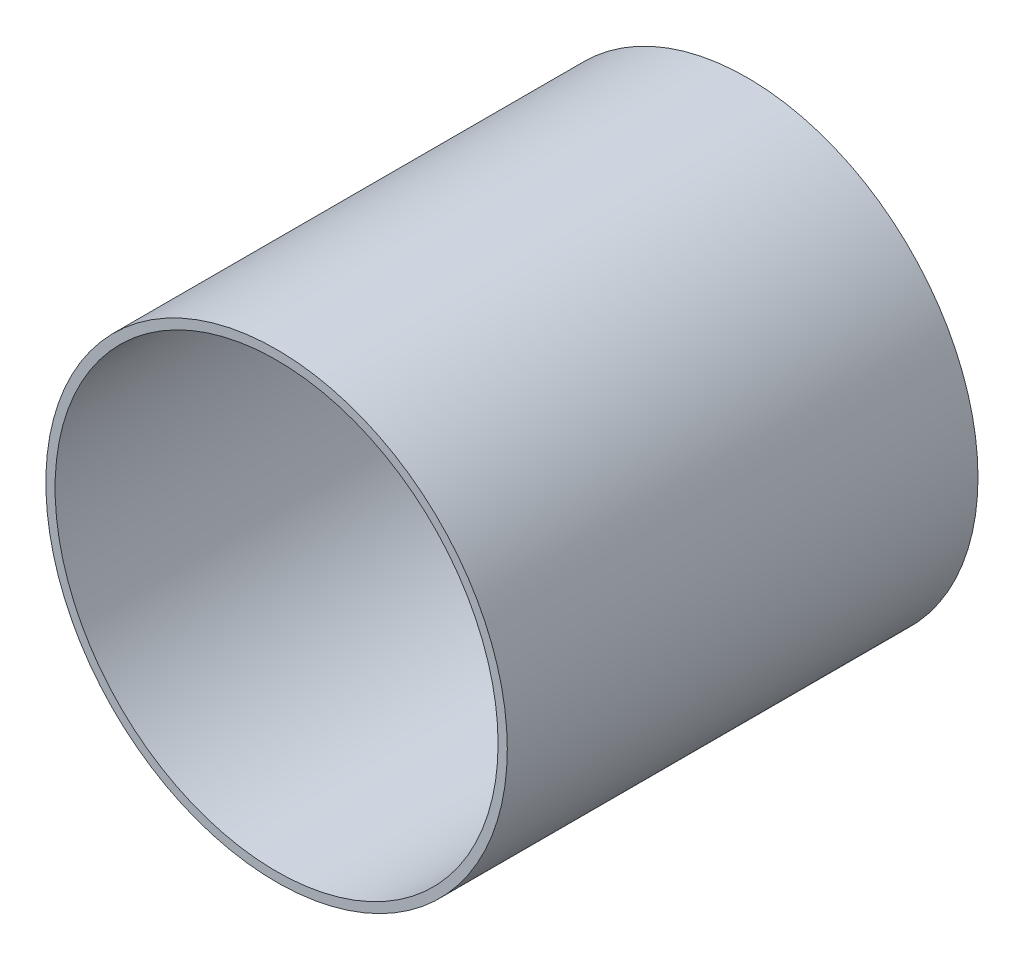
ISO-10303-21;
HEADER;
FILE_DESCRIPTION(('STEP AP214'),'2;1');
FILE_NAME('part.step','',(''),(''),'','','');
FILE_SCHEMA(('AUTOMOTIVE_DESIGN { 1 0 10303 214 1 1 1 1 }'));
ENDSEC;
DATA;
#1=APPLICATION_CONTEXT('core data for automotive mechanical design processes');
#2=APPLICATION_PROTOCOL_DEFINITION('international standard','automotive_design',2000,#1);
#3=PRODUCT_CONTEXT('',#1,'mechanical');
#4=PRODUCT('Part','Part','',(#3));
#5=PRODUCT_RELATED_PRODUCT_CATEGORY('part','',(#4));
#6=PRODUCT_DEFINITION_FORMATION('','',#4);
#7=PRODUCT_DEFINITION_CONTEXT('part definition',#1,'design');
#8=PRODUCT_DEFINITION('design','',#6,#7);
#9=PRODUCT_DEFINITION_SHAPE('','',#8);
#10=(LENGTH_UNIT() NAMED_UNIT(*) SI_UNIT(.MILLI.,.METRE.));
#11=(NAMED_UNIT(*) PLANE_ANGLE_UNIT() SI_UNIT($,.RADIAN.));
#12=(NAMED_UNIT(*) SI_UNIT($,.STERADIAN.) SOLID_ANGLE_UNIT());
#13=UNCERTAINTY_MEASURE_WITH_UNIT(LENGTH_MEASURE(1.E-05),#10,'distance_accuracy_value','');
#14=(GEOMETRIC_REPRESENTATION_CONTEXT(3) GLOBAL_UNCERTAINTY_ASSIGNED_CONTEXT((#13)) GLOBAL_UNIT_ASSIGNED_CONTEXT((#10,
#11,#12)) REPRESENTATION_CONTEXT('',''));
#15=CARTESIAN_POINT('',(0.,0.,0.));
#16=DIRECTION('',(0.,0.,1.));
#17=DIRECTION('',(1.,0.,0.));
#18=AXIS2_PLACEMENT_3D('',#15,#16,#17);
#19=CARTESIAN_POINT('',(0.,0.,3.));
#20=DIRECTION('',(0.,0.,-1.));
#21=DIRECTION('',(-1.,0.,0.));
#22=AXIS2_PLACEMENT_3D('',#19,#20,#21);
#23=CYLINDRICAL_SURFACE('',#22,75.);
#24=CARTESIAN_POINT('',(0.,0.,0.));
#25=DIRECTION('',(0.,0.,1.));
#26=DIRECTION('',(1.,0.,0.));
#27=AXIS2_PLACEMENT_3D('',#24,#25,#26);
#28=CIRCLE('',#27,75.);
#29=CARTESIAN_POINT('',(75.,0.,0.));
#30=VERTEX_POINT('',#29);
#31=EDGE_CURVE('E44',#30,#30,#28,.T.);
#32=ORIENTED_EDGE('',*,*,#31,.T.);
#33=EDGE_LOOP('',(#32));
#34=FACE_BOUND('',#33,.T.);
#35=CARTESIAN_POINT('',(0.,0.,153.));
#36=DIRECTION('',(0.,0.,1.));
#37=DIRECTION('',(1.,0.,0.));
#38=AXIS2_PLACEMENT_3D('',#35,#36,#37);
#39=CIRCLE('',#38,75.);
#40=CARTESIAN_POINT('',(75.,0.,153.));
#41=VERTEX_POINT('',#40);
#42=EDGE_CURVE('E49',#41,#41,#39,.T.);
#43=ORIENTED_EDGE('',*,*,#42,.F.);
#44=EDGE_LOOP('',(#43));
#45=FACE_BOUND('',#44,.T.);
#46=ADVANCED_FACE('F37',(#34,#45),#23,.T.);
#47=CARTESIAN_POINT('',(0.,0.,0.));
#48=DIRECTION('',(0.,0.,1.));
#49=DIRECTION('',(1.,0.,0.));
#50=AXIS2_PLACEMENT_3D('',#47,#48,#49);
#51=PLANE('',#50);
#52=CARTESIAN_POINT('',(30.,0.,0.));
#53=DIRECTION('',(0.,0.,1.));
#54=DIRECTION('',(1.,0.,0.));
#55=AXIS2_PLACEMENT_3D('',#52,#53,#54);
#56=CIRCLE('',#55,5.);
#57=CARTESIAN_POINT('',(35.,0.,0.));
#58=VERTEX_POINT('',#57);
#59=EDGE_CURVE('E60',#58,#58,#56,.T.);
#60=ORIENTED_EDGE('',*,*,#59,.T.);
#61=EDGE_LOOP('',(#60));
#62=FACE_BOUND('',#61,.T.);
#63=CARTESIAN_POINT('',(-30.,0.,0.));
#64=DIRECTION('',(0.,0.,1.));
#65=DIRECTION('',(1.,0.,0.));
#66=AXIS2_PLACEMENT_3D('',#63,#64,#65);
#67=CIRCLE('',#66,5.);
#68=CARTESIAN_POINT('',(-25.,0.,0.));
#69=VERTEX_POINT('',#68);
#70=EDGE_CURVE('E64',#69,#69,#67,.T.);
#71=ORIENTED_EDGE('',*,*,#70,.T.);
#72=EDGE_LOOP('',(#71));
#73=FACE_BOUND('',#72,.T.);
#74=ORIENTED_EDGE('',*,*,#31,.F.);
#75=EDGE_LOOP('',(#74));
#76=FACE_BOUND('',#75,.T.);
#77=ADVANCED_FACE('F94',(#62,#73,#76),#51,.F.);
#78=CARTESIAN_POINT('',(0.,0.,153.));
#79=DIRECTION('',(0.,0.,1.));
#80=DIRECTION('',(1.,0.,0.));
#81=AXIS2_PLACEMENT_3D('',#78,#79,#80);
#82=PLANE('',#81);
#83=ORIENTED_EDGE('',*,*,#42,.T.);
#84=EDGE_LOOP('',(#83));
#85=FACE_BOUND('',#84,.T.);
#86=CARTESIAN_POINT('',(0.,0.,153.));
#87=DIRECTION('',(0.,0.,1.));
#88=DIRECTION('',(1.,0.,0.));
#89=AXIS2_PLACEMENT_3D('',#86,#87,#88);
#90=CIRCLE('',#89,72.);
#91=CARTESIAN_POINT('',(72.,0.,153.));
#92=VERTEX_POINT('',#91);
#93=EDGE_CURVE('E54',#92,#92,#90,.T.);
#94=ORIENTED_EDGE('',*,*,#93,.F.);
#95=EDGE_LOOP('',(#94));
#96=FACE_BOUND('',#95,.T.);
#97=ADVANCED_FACE('F97',(#85,#96),#82,.T.);
#98=CARTESIAN_POINT('',(0.,0.,153.));
#99=DIRECTION('',(0.,0.,-1.));
#100=DIRECTION('',(-1.,0.,0.));
#101=AXIS2_PLACEMENT_3D('',#98,#99,#100);
#102=CYLINDRICAL_SURFACE('',#101,72.);
#103=ORIENTED_EDGE('',*,*,#93,.T.);
#104=EDGE_LOOP('',(#103));
#105=FACE_BOUND('',#104,.T.);
#106=CARTESIAN_POINT('',(0.,0.,3.));
#107=DIRECTION('',(0.,0.,1.));
#108=DIRECTION('',(1.,0.,0.));
#109=AXIS2_PLACEMENT_3D('',#106,#107,#108);
#110=CIRCLE('',#109,72.);
#111=CARTESIAN_POINT('',(72.,0.,3.));
#112=VERTEX_POINT('',#111);
#113=EDGE_CURVE('E10',#112,#112,#110,.F.);
#114=ORIENTED_EDGE('',*,*,#113,.T.);
#115=EDGE_LOOP('',(#114));
#116=FACE_BOUND('',#115,.T.);
#117=ADVANCED_FACE('F84',(#105,#116),#102,.F.);
#118=CARTESIAN_POINT('',(0.,0.,3.));
#119=DIRECTION('',(0.,0.,1.));
#120=DIRECTION('',(1.,0.,0.));
#121=AXIS2_PLACEMENT_3D('',#118,#119,#120);
#122=PLANE('',#121);
#123=CARTESIAN_POINT('',(30.,0.,3.));
#124=DIRECTION('',(0.,0.,1.));
#125=DIRECTION('',(1.,0.,0.));
#126=AXIS2_PLACEMENT_3D('',#123,#124,#125);
#127=CIRCLE('',#126,5.);
#128=CARTESIAN_POINT('',(35.,0.,3.));
#129=VERTEX_POINT('',#128);
#130=EDGE_CURVE('E68',#129,#129,#127,.T.);
#131=ORIENTED_EDGE('',*,*,#130,.F.);
#132=EDGE_LOOP('',(#131));
#133=FACE_BOUND('',#132,.T.);
#134=CARTESIAN_POINT('',(-30.,0.,3.));
#135=DIRECTION('',(0.,0.,1.));
#136=DIRECTION('',(1.,0.,0.));
#137=AXIS2_PLACEMENT_3D('',#134,#135,#136);
#138=CIRCLE('',#137,5.);
#139=CARTESIAN_POINT('',(-25.,0.,3.));
#140=VERTEX_POINT('',#139);
#141=EDGE_CURVE('E69',#140,#140,#138,.T.);
#142=ORIENTED_EDGE('',*,*,#141,.F.);
#143=EDGE_LOOP('',(#142));
#144=FACE_BOUND('',#143,.T.);
#145=ORIENTED_EDGE('',*,*,#113,.F.);
#146=EDGE_LOOP('',(#145));
#147=FACE_BOUND('',#146,.T.);
#148=ADVANCED_FACE('F80',(#133,#144,#147),#122,.T.);
#149=CARTESIAN_POINT('',(-30.,0.,-147.));
#150=DIRECTION('',(0.,0.,1.));
#151=DIRECTION('',(1.,0.,0.));
#152=AXIS2_PLACEMENT_3D('',#149,#150,#151);
#153=CYLINDRICAL_SURFACE('',#152,5.);
#154=ORIENTED_EDGE('',*,*,#141,.T.);
#155=EDGE_LOOP('',(#154));
#156=FACE_BOUND('',#155,.T.);
#157=ORIENTED_EDGE('',*,*,#70,.F.);
#158=EDGE_LOOP('',(#157));
#159=FACE_BOUND('',#158,.T.);
#160=ADVANCED_FACE('F83',(#156,#159),#153,.F.);
#161=CARTESIAN_POINT('',(30.,0.,-147.));
#162=DIRECTION('',(0.,0.,1.));
#163=DIRECTION('',(1.,0.,0.));
#164=AXIS2_PLACEMENT_3D('',#161,#162,#163);
#165=CYLINDRICAL_SURFACE('',#164,5.);
#166=ORIENTED_EDGE('',*,*,#130,.T.);
#167=EDGE_LOOP('',(#166));
#168=FACE_BOUND('',#167,.T.);
#169=ORIENTED_EDGE('',*,*,#59,.F.);
#170=EDGE_LOOP('',(#169));
#171=FACE_BOUND('',#170,.T.);
#172=ADVANCED_FACE('F77',(#168,#171),#165,.F.);
#173=CLOSED_SHELL('',(#46,#77,#97,#117,#148,#160,#172));
#174=MANIFOLD_SOLID_BREP('B2',#173);
#175=ADVANCED_BREP_SHAPE_REPRESENTATION('',(#18,#174),#14);
#176=SHAPE_DEFINITION_REPRESENTATION(#9,#175);
ENDSEC;
END-ISO-10303-21;
